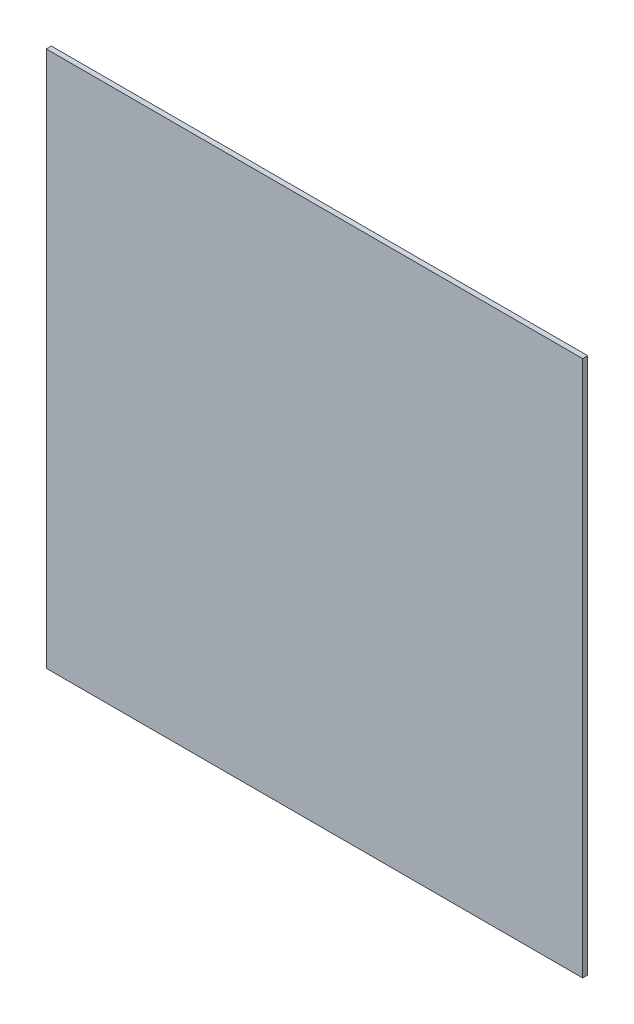
ISO-10303-21;
HEADER;
FILE_DESCRIPTION(('STEP AP214'),'2;1');
FILE_NAME('part.step','',(''),(''),'','','');
FILE_SCHEMA(('AUTOMOTIVE_DESIGN { 1 0 10303 214 1 1 1 1 }'));
ENDSEC;
DATA;
#1=APPLICATION_CONTEXT('core data for automotive mechanical design processes');
#2=APPLICATION_PROTOCOL_DEFINITION('international standard','automotive_design',2000,#1);
#3=PRODUCT_CONTEXT('',#1,'mechanical');
#4=PRODUCT('Part','Part','',(#3));
#5=PRODUCT_RELATED_PRODUCT_CATEGORY('part','',(#4));
#6=PRODUCT_DEFINITION_FORMATION('','',#4);
#7=PRODUCT_DEFINITION_CONTEXT('part definition',#1,'design');
#8=PRODUCT_DEFINITION('design','',#6,#7);
#9=PRODUCT_DEFINITION_SHAPE('','',#8);
#10=(LENGTH_UNIT() NAMED_UNIT(*) SI_UNIT(.MILLI.,.METRE.));
#11=(NAMED_UNIT(*) PLANE_ANGLE_UNIT() SI_UNIT($,.RADIAN.));
#12=(NAMED_UNIT(*) SI_UNIT($,.STERADIAN.) SOLID_ANGLE_UNIT());
#13=UNCERTAINTY_MEASURE_WITH_UNIT(LENGTH_MEASURE(1.E-05),#10,'distance_accuracy_value','');
#14=(GEOMETRIC_REPRESENTATION_CONTEXT(3) GLOBAL_UNCERTAINTY_ASSIGNED_CONTEXT((#13)) GLOBAL_UNIT_ASSIGNED_CONTEXT((#10,
#11,#12)) REPRESENTATION_CONTEXT('',''));
#15=CARTESIAN_POINT('',(0.,0.,0.));
#16=DIRECTION('',(0.,0.,1.));
#17=DIRECTION('',(1.,0.,0.));
#18=AXIS2_PLACEMENT_3D('',#15,#16,#17);
#19=CARTESIAN_POINT('',(9.,0.,0.17));
#20=DIRECTION('',(1.,0.,0.));
#21=DIRECTION('',(0.,1.,0.));
#22=AXIS2_PLACEMENT_3D('',#19,#20,#21);
#23=PLANE('',#22);
#24=DIRECTION('',(0.,-1.,0.));
#25=VECTOR('',#24,1.);
#26=CARTESIAN_POINT('',(9.,0.,0.));
#27=LINE('',#26,#25);
#28=CARTESIAN_POINT('',(9.,9.,0.));
#29=VERTEX_POINT('',#28);
#30=CARTESIAN_POINT('',(9.,-9.,0.));
#31=VERTEX_POINT('',#30);
#32=EDGE_CURVE('E101',#29,#31,#27,.T.);
#33=ORIENTED_EDGE('',*,*,#32,.F.);
#34=DIRECTION('',(0.,0.,-1.));
#35=VECTOR('',#34,1.);
#36=CARTESIAN_POINT('',(9.,9.,0.17));
#37=LINE('',#36,#35);
#38=CARTESIAN_POINT('',(9.,9.,0.17));
#39=VERTEX_POINT('',#38);
#40=EDGE_CURVE('E10',#39,#29,#37,.T.);
#41=ORIENTED_EDGE('',*,*,#40,.F.);
#42=DIRECTION('',(0.,-1.,0.));
#43=VECTOR('',#42,1.);
#44=CARTESIAN_POINT('',(9.,0.,0.17));
#45=LINE('',#44,#43);
#46=CARTESIAN_POINT('',(9.,-9.,0.17));
#47=VERTEX_POINT('',#46);
#48=EDGE_CURVE('E79',#39,#47,#45,.T.);
#49=ORIENTED_EDGE('',*,*,#48,.T.);
#50=DIRECTION('',(0.,0.,-1.));
#51=VECTOR('',#50,1.);
#52=CARTESIAN_POINT('',(9.,-9.,0.17));
#53=LINE('',#52,#51);
#54=EDGE_CURVE('E38',#47,#31,#53,.T.);
#55=ORIENTED_EDGE('',*,*,#54,.T.);
#56=EDGE_LOOP('',(#33,#41,#49,#55));
#57=FACE_BOUND('',#56,.T.);
#58=ADVANCED_FACE('F16',(#57),#23,.T.);
#59=CARTESIAN_POINT('',(0.,9.,0.17));
#60=DIRECTION('',(0.,-1.,0.));
#61=DIRECTION('',(0.,0.,-1.));
#62=AXIS2_PLACEMENT_3D('',#59,#60,#61);
#63=PLANE('',#62);
#64=DIRECTION('',(-1.,0.,0.));
#65=VECTOR('',#64,1.);
#66=CARTESIAN_POINT('',(0.,9.,0.));
#67=LINE('',#66,#65);
#68=CARTESIAN_POINT('',(-9.,9.,0.));
#69=VERTEX_POINT('',#68);
#70=EDGE_CURVE('E86',#29,#69,#67,.T.);
#71=ORIENTED_EDGE('',*,*,#70,.T.);
#72=DIRECTION('',(0.,0.,-1.));
#73=VECTOR('',#72,1.);
#74=CARTESIAN_POINT('',(-9.,9.,0.17));
#75=LINE('',#74,#73);
#76=CARTESIAN_POINT('',(-9.,9.,0.17));
#77=VERTEX_POINT('',#76);
#78=EDGE_CURVE('E25',#77,#69,#75,.T.);
#79=ORIENTED_EDGE('',*,*,#78,.F.);
#80=DIRECTION('',(-1.,0.,0.));
#81=VECTOR('',#80,1.);
#82=CARTESIAN_POINT('',(0.,9.,0.17));
#83=LINE('',#82,#81);
#84=EDGE_CURVE('E73',#39,#77,#83,.T.);
#85=ORIENTED_EDGE('',*,*,#84,.F.);
#86=ORIENTED_EDGE('',*,*,#40,.T.);
#87=EDGE_LOOP('',(#71,#79,#85,#86));
#88=FACE_BOUND('',#87,.T.);
#89=ADVANCED_FACE('F84',(#88),#63,.F.);
#90=CARTESIAN_POINT('',(-9.,0.,0.17));
#91=DIRECTION('',(1.,0.,0.));
#92=DIRECTION('',(0.,1.,0.));
#93=AXIS2_PLACEMENT_3D('',#90,#91,#92);
#94=PLANE('',#93);
#95=DIRECTION('',(0.,-1.,0.));
#96=VECTOR('',#95,1.);
#97=CARTESIAN_POINT('',(-9.,0.,0.));
#98=LINE('',#97,#96);
#99=CARTESIAN_POINT('',(-9.,-9.,0.));
#100=VERTEX_POINT('',#99);
#101=EDGE_CURVE('E106',#69,#100,#98,.T.);
#102=ORIENTED_EDGE('',*,*,#101,.T.);
#103=DIRECTION('',(0.,0.,-1.));
#104=VECTOR('',#103,1.);
#105=CARTESIAN_POINT('',(-9.,-9.,0.17));
#106=LINE('',#105,#104);
#107=CARTESIAN_POINT('',(-9.,-9.,0.17));
#108=VERTEX_POINT('',#107);
#109=EDGE_CURVE('E56',#108,#100,#106,.T.);
#110=ORIENTED_EDGE('',*,*,#109,.F.);
#111=DIRECTION('',(0.,-1.,0.));
#112=VECTOR('',#111,1.);
#113=CARTESIAN_POINT('',(-9.,0.,0.17));
#114=LINE('',#113,#112);
#115=EDGE_CURVE('E78',#77,#108,#114,.T.);
#116=ORIENTED_EDGE('',*,*,#115,.F.);
#117=ORIENTED_EDGE('',*,*,#78,.T.);
#118=EDGE_LOOP('',(#102,#110,#116,#117));
#119=FACE_BOUND('',#118,.T.);
#120=ADVANCED_FACE('F90',(#119),#94,.F.);
#121=CARTESIAN_POINT('',(0.,-9.,0.17));
#122=DIRECTION('',(0.,-1.,0.));
#123=DIRECTION('',(0.,0.,-1.));
#124=AXIS2_PLACEMENT_3D('',#121,#122,#123);
#125=PLANE('',#124);
#126=DIRECTION('',(-1.,0.,0.));
#127=VECTOR('',#126,1.);
#128=CARTESIAN_POINT('',(0.,-9.,0.));
#129=LINE('',#128,#127);
#130=EDGE_CURVE('E108',#31,#100,#129,.T.);
#131=ORIENTED_EDGE('',*,*,#130,.F.);
#132=ORIENTED_EDGE('',*,*,#54,.F.);
#133=DIRECTION('',(-1.,0.,0.));
#134=VECTOR('',#133,1.);
#135=CARTESIAN_POINT('',(0.,-9.,0.17));
#136=LINE('',#135,#134);
#137=EDGE_CURVE('E92',#47,#108,#136,.T.);
#138=ORIENTED_EDGE('',*,*,#137,.T.);
#139=ORIENTED_EDGE('',*,*,#109,.T.);
#140=EDGE_LOOP('',(#131,#132,#138,#139));
#141=FACE_BOUND('',#140,.T.);
#142=ADVANCED_FACE('F127',(#141),#125,.T.);
#143=CARTESIAN_POINT('',(0.,0.,0.17));
#144=DIRECTION('',(0.,0.,1.));
#145=DIRECTION('',(1.,0.,0.));
#146=AXIS2_PLACEMENT_3D('',#143,#144,#145);
#147=PLANE('',#146);
#148=ORIENTED_EDGE('',*,*,#48,.F.);
#149=ORIENTED_EDGE('',*,*,#84,.T.);
#150=ORIENTED_EDGE('',*,*,#115,.T.);
#151=ORIENTED_EDGE('',*,*,#137,.F.);
#152=EDGE_LOOP('',(#148,#149,#150,#151));
#153=FACE_BOUND('',#152,.T.);
#154=ADVANCED_FACE('F75',(#153),#147,.T.);
#155=CARTESIAN_POINT('',(0.,0.,0.));
#156=DIRECTION('',(0.,0.,1.));
#157=DIRECTION('',(1.,0.,0.));
#158=AXIS2_PLACEMENT_3D('',#155,#156,#157);
#159=PLANE('',#158);
#160=ORIENTED_EDGE('',*,*,#32,.T.);
#161=ORIENTED_EDGE('',*,*,#130,.T.);
#162=ORIENTED_EDGE('',*,*,#101,.F.);
#163=ORIENTED_EDGE('',*,*,#70,.F.);
#164=EDGE_LOOP('',(#160,#161,#162,#163));
#165=FACE_BOUND('',#164,.T.);
#166=ADVANCED_FACE('F135',(#165),#159,.F.);
#167=CLOSED_SHELL('',(#58,#89,#120,#142,#154,#166));
#168=MANIFOLD_SOLID_BREP('B1',#167);
#169=ADVANCED_BREP_SHAPE_REPRESENTATION('',(#18,#168),#14);
#170=SHAPE_DEFINITION_REPRESENTATION(#9,#169);
ENDSEC;
END-ISO-10303-21;
